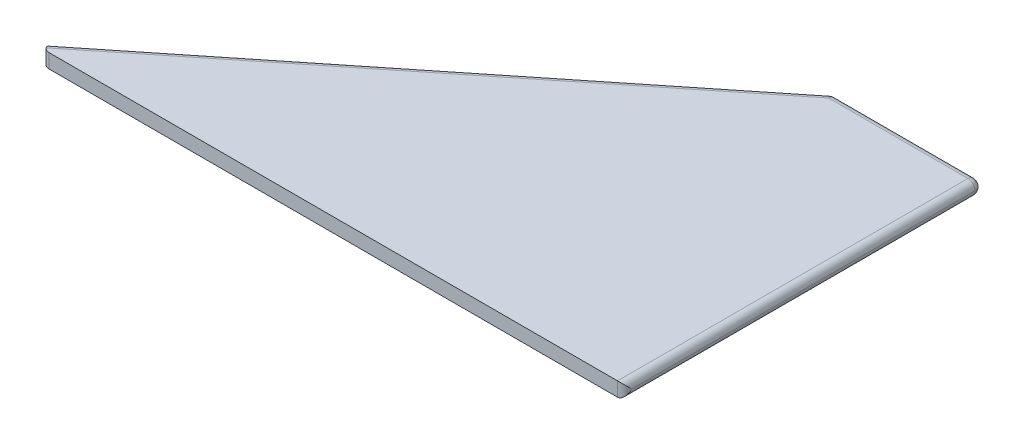
ISO-10303-21;
HEADER;
FILE_DESCRIPTION(('STEP AP214'),'2;1');
FILE_NAME('part.step','',(''),(''),'','','');
FILE_SCHEMA(('AUTOMOTIVE_DESIGN { 1 0 10303 214 1 1 1 1 }'));
ENDSEC;
DATA;
#1=APPLICATION_CONTEXT('core data for automotive mechanical design processes');
#2=APPLICATION_PROTOCOL_DEFINITION('international standard','automotive_design',2000,#1);
#3=PRODUCT_CONTEXT('',#1,'mechanical');
#4=PRODUCT('Part','Part','',(#3));
#5=PRODUCT_RELATED_PRODUCT_CATEGORY('part','',(#4));
#6=PRODUCT_DEFINITION_FORMATION('','',#4);
#7=PRODUCT_DEFINITION_CONTEXT('part definition',#1,'design');
#8=PRODUCT_DEFINITION('design','',#6,#7);
#9=PRODUCT_DEFINITION_SHAPE('','',#8);
#10=(LENGTH_UNIT() NAMED_UNIT(*) SI_UNIT(.MILLI.,.METRE.));
#11=(NAMED_UNIT(*) PLANE_ANGLE_UNIT() SI_UNIT($,.RADIAN.));
#12=(NAMED_UNIT(*) SI_UNIT($,.STERADIAN.) SOLID_ANGLE_UNIT());
#13=UNCERTAINTY_MEASURE_WITH_UNIT(LENGTH_MEASURE(1.E-05),#10,'distance_accuracy_value','');
#14=(GEOMETRIC_REPRESENTATION_CONTEXT(3) GLOBAL_UNCERTAINTY_ASSIGNED_CONTEXT((#13)) GLOBAL_UNIT_ASSIGNED_CONTEXT((#10,
#11,#12)) REPRESENTATION_CONTEXT('',''));
#15=CARTESIAN_POINT('',(0.,0.,0.));
#16=DIRECTION('',(0.,0.,1.));
#17=DIRECTION('',(1.,0.,0.));
#18=AXIS2_PLACEMENT_3D('',#15,#16,#17);
#19=CARTESIAN_POINT('',(0.,4.76,0.));
#20=DIRECTION('',(0.,0.,-1.));
#21=DIRECTION('',(-1.,0.,0.));
#22=AXIS2_PLACEMENT_3D('',#19,#20,#21);
#23=PLANE('',#22);
#24=DIRECTION('',(1.,0.,0.));
#25=VECTOR('',#24,1.);
#26=CARTESIAN_POINT('',(0.,4.76,0.));
#27=LINE('',#26,#25);
#28=CARTESIAN_POINT('',(-193.215141078727,4.76,0.));
#29=VERTEX_POINT('',#28);
#30=CARTESIAN_POINT('',(-2.38,4.76,0.));
#31=VERTEX_POINT('',#30);
#32=EDGE_CURVE('E239',#29,#31,#27,.T.);
#33=ORIENTED_EDGE('',*,*,#32,.F.);
#34=DIRECTION('',(0.,-1.,0.));
#35=VECTOR('',#34,1.);
#36=CARTESIAN_POINT('',(-193.215141078727,4.76,0.));
#37=LINE('',#36,#35);
#38=CARTESIAN_POINT('',(-193.215141078727,0.,0.));
#39=VERTEX_POINT('',#38);
#40=EDGE_CURVE('E132',#29,#39,#37,.T.);
#41=ORIENTED_EDGE('',*,*,#40,.T.);
#42=DIRECTION('',(1.,0.,0.));
#43=VECTOR('',#42,1.);
#44=CARTESIAN_POINT('',(0.,0.,0.));
#45=LINE('',#44,#43);
#46=CARTESIAN_POINT('',(-2.38,0.,0.));
#47=VERTEX_POINT('',#46);
#48=EDGE_CURVE('E242',#39,#47,#45,.T.);
#49=ORIENTED_EDGE('',*,*,#48,.T.);
#50=DIRECTION('',(0.,-1.,0.));
#51=VECTOR('',#50,1.);
#52=CARTESIAN_POINT('',(-2.38,4.76,0.));
#53=LINE('',#52,#51);
#54=EDGE_CURVE('E174',#47,#31,#53,.F.);
#55=ORIENTED_EDGE('',*,*,#54,.T.);
#56=EDGE_LOOP('',(#33,#41,#49,#55));
#57=FACE_BOUND('',#56,.T.);
#58=ADVANCED_FACE('F45',(#57),#23,.F.);
#59=CARTESIAN_POINT('',(0.,4.76,0.));
#60=DIRECTION('',(0.,-1.,0.));
#61=DIRECTION('',(0.,0.,-1.));
#62=AXIS2_PLACEMENT_3D('',#59,#60,#61);
#63=PLANE('',#62);
#64=DIRECTION('',(-0.78086880944303,0.,0.624695047554424));
#65=VECTOR('',#64,1.);
#66=CARTESIAN_POINT('',(-76.5620062746253,4.76,-95.7025078432817));
#67=LINE('',#66,#65);
#68=CARTESIAN_POINT('',(-49.1651410787274,4.76,-117.62));
#69=VERTEX_POINT('',#68);
#70=CARTESIAN_POINT('',(-195.073608845202,4.76,-0.89322578682044));
#71=VERTEX_POINT('',#70);
#72=EDGE_CURVE('E181',#69,#71,#67,.T.);
#73=ORIENTED_EDGE('',*,*,#72,.T.);
#74=CARTESIAN_POINT('',(-193.215141078727,4.76,-2.37999999999998));
#75=DIRECTION('',(0.,-1.,0.));
#76=DIRECTION('',(0.,0.,-1.));
#77=AXIS2_PLACEMENT_3D('',#74,#75,#76);
#78=CIRCLE('',#77,2.38);
#79=EDGE_CURVE('E101',#71,#29,#78,.F.);
#80=ORIENTED_EDGE('',*,*,#79,.T.);
#81=ORIENTED_EDGE('',*,*,#32,.T.);
#82=DIRECTION('',(0.,0.,-1.));
#83=VECTOR('',#82,1.);
#84=CARTESIAN_POINT('',(-2.38,4.76,0.));
#85=LINE('',#84,#83);
#86=CARTESIAN_POINT('',(-2.38,4.76,-117.62));
#87=VERTEX_POINT('',#86);
#88=EDGE_CURVE('E172',#31,#87,#85,.T.);
#89=ORIENTED_EDGE('',*,*,#88,.T.);
#90=DIRECTION('',(-1.,0.,0.));
#91=VECTOR('',#90,1.);
#92=CARTESIAN_POINT('',(0.,4.76,-117.62));
#93=LINE('',#92,#91);
#94=EDGE_CURVE('E234',#87,#69,#93,.T.);
#95=ORIENTED_EDGE('',*,*,#94,.T.);
#96=EDGE_LOOP('',(#73,#80,#81,#89,#95));
#97=FACE_BOUND('',#96,.T.);
#98=ADVANCED_FACE('F246',(#97),#63,.F.);
#99=CARTESIAN_POINT('',(0.,0.,0.));
#100=DIRECTION('',(0.,-1.,0.));
#101=DIRECTION('',(0.,0.,-1.));
#102=AXIS2_PLACEMENT_3D('',#99,#100,#101);
#103=PLANE('',#102);
#104=ORIENTED_EDGE('',*,*,#48,.F.);
#105=CARTESIAN_POINT('',(-193.215141078727,0.,-2.37999999999998));
#106=DIRECTION('',(0.,-1.,0.));
#107=DIRECTION('',(0.,0.,-1.));
#108=AXIS2_PLACEMENT_3D('',#105,#106,#107);
#109=CIRCLE('',#108,2.38);
#110=CARTESIAN_POINT('',(-195.073608845202,0.,-0.89322578682044));
#111=VERTEX_POINT('',#110);
#112=EDGE_CURVE('E11',#39,#111,#109,.T.);
#113=ORIENTED_EDGE('',*,*,#112,.T.);
#114=DIRECTION('',(-0.78086880944303,0.,0.624695047554424));
#115=VECTOR('',#114,1.);
#116=CARTESIAN_POINT('',(-48.5132257868205,0.,-118.141532233526));
#117=LINE('',#116,#115);
#118=CARTESIAN_POINT('',(-49.1651410787274,0.,-117.62));
#119=VERTEX_POINT('',#118);
#120=EDGE_CURVE('E56',#111,#119,#117,.F.);
#121=ORIENTED_EDGE('',*,*,#120,.T.);
#122=DIRECTION('',(-1.,0.,0.));
#123=VECTOR('',#122,1.);
#124=CARTESIAN_POINT('',(0.,0.,-117.62));
#125=LINE('',#124,#123);
#126=CARTESIAN_POINT('',(-2.38,0.,-117.62));
#127=VERTEX_POINT('',#126);
#128=EDGE_CURVE('E122',#119,#127,#125,.F.);
#129=ORIENTED_EDGE('',*,*,#128,.T.);
#130=DIRECTION('',(0.,0.,-1.));
#131=VECTOR('',#130,1.);
#132=CARTESIAN_POINT('',(-2.38,0.,0.));
#133=LINE('',#132,#131);
#134=EDGE_CURVE('E124',#127,#47,#133,.F.);
#135=ORIENTED_EDGE('',*,*,#134,.T.);
#136=EDGE_LOOP('',(#104,#113,#121,#129,#135));
#137=FACE_BOUND('',#136,.T.);
#138=ADVANCED_FACE('F123',(#137),#103,.T.);
#139=CARTESIAN_POINT('',(-2.38,2.38,0.));
#140=DIRECTION('',(0.,0.,1.));
#141=DIRECTION('',(1.,0.,0.));
#142=AXIS2_PLACEMENT_3D('',#139,#140,#141);
#143=CYLINDRICAL_SURFACE('',#142,2.38);
#144=CARTESIAN_POINT('',(-2.38,2.38,-2.38));
#145=DIRECTION('',(0.,0.707106781186547,0.707106781186547));
#146=DIRECTION('',(0.,-0.707106781186547,0.707106781186547));
#147=AXIS2_PLACEMENT_3D('',#144,#145,#146);
#148=ELLIPSE('',#147,3.36582827844797,2.38);
#149=CARTESIAN_POINT('',(0.,2.38,-2.38));
#150=VERTEX_POINT('',#149);
#151=EDGE_CURVE('E49',#47,#150,#148,.T.);
#152=ORIENTED_EDGE('',*,*,#151,.F.);
#153=ORIENTED_EDGE('',*,*,#134,.F.);
#154=CARTESIAN_POINT('',(-2.38,2.38,-117.62));
#155=DIRECTION('',(0.,0.,-1.));
#156=DIRECTION('',(-1.,0.,0.));
#157=AXIS2_PLACEMENT_3D('',#154,#155,#156);
#158=CIRCLE('',#157,2.38);
#159=CARTESIAN_POINT('',(0.,2.38,-117.62));
#160=VERTEX_POINT('',#159);
#161=EDGE_CURVE('E86',#160,#127,#158,.T.);
#162=ORIENTED_EDGE('',*,*,#161,.F.);
#163=DIRECTION('',(0.,0.,-1.));
#164=VECTOR('',#163,1.);
#165=CARTESIAN_POINT('',(0.,2.38,-120.));
#166=LINE('',#165,#164);
#167=EDGE_CURVE('E153',#150,#160,#166,.T.);
#168=ORIENTED_EDGE('',*,*,#167,.F.);
#169=EDGE_LOOP('',(#152,#153,#162,#168));
#170=FACE_BOUND('',#169,.T.);
#171=ADVANCED_FACE('F47',(#170),#143,.T.);
#172=CARTESIAN_POINT('',(-2.38,4.76,-2.38));
#173=DIRECTION('',(0.,-1.,0.));
#174=DIRECTION('',(0.,0.,-1.));
#175=AXIS2_PLACEMENT_3D('',#172,#173,#174);
#176=CYLINDRICAL_SURFACE('',#175,2.38);
#177=ORIENTED_EDGE('',*,*,#54,.F.);
#178=ORIENTED_EDGE('',*,*,#151,.T.);
#179=CARTESIAN_POINT('',(-2.38,2.38,-2.38));
#180=DIRECTION('',(0.,0.707106781186547,-0.707106781186547));
#181=DIRECTION('',(0.,-0.707106781186547,-0.707106781186547));
#182=AXIS2_PLACEMENT_3D('',#179,#180,#181);
#183=ELLIPSE('',#182,3.36582827844797,2.38);
#184=EDGE_CURVE('E147',#31,#150,#183,.T.);
#185=ORIENTED_EDGE('',*,*,#184,.F.);
#186=EDGE_LOOP('',(#177,#178,#185));
#187=FACE_BOUND('',#186,.T.);
#188=ADVANCED_FACE('F173',(#187),#176,.T.);
#189=CARTESIAN_POINT('',(-2.38,2.38,-117.62));
#190=DIRECTION('',(1.,0.,0.));
#191=DIRECTION('',(0.,0.,-1.));
#192=AXIS2_PLACEMENT_3D('',#189,#190,#191);
#193=SPHERICAL_SURFACE('',#192,2.38);
#194=CARTESIAN_POINT('',(-2.38,2.38,-117.62));
#195=DIRECTION('',(0.,-1.,0.));
#196=DIRECTION('',(0.,0.,-1.));
#197=AXIS2_PLACEMENT_3D('',#194,#195,#196);
#198=CIRCLE('',#197,2.38);
#199=CARTESIAN_POINT('',(-2.38,2.38,-120.));
#200=VERTEX_POINT('',#199);
#201=EDGE_CURVE('E138',#160,#200,#198,.F.);
#202=ORIENTED_EDGE('',*,*,#201,.F.);
#203=ORIENTED_EDGE('',*,*,#161,.T.);
#204=CARTESIAN_POINT('',(-2.38,2.38,-117.62));
#205=DIRECTION('',(1.,0.,0.));
#206=DIRECTION('',(0.,0.,-1.));
#207=AXIS2_PLACEMENT_3D('',#204,#205,#206);
#208=CIRCLE('',#207,2.38);
#209=EDGE_CURVE('E136',#200,#127,#208,.F.);
#210=ORIENTED_EDGE('',*,*,#209,.F.);
#211=EDGE_LOOP('',(#202,#203,#210));
#212=FACE_BOUND('',#211,.T.);
#213=ADVANCED_FACE('F135',(#212),#193,.T.);
#214=CARTESIAN_POINT('',(-2.38,2.38,0.));
#215=DIRECTION('',(0.,0.,-1.));
#216=DIRECTION('',(-1.,0.,0.));
#217=AXIS2_PLACEMENT_3D('',#214,#215,#216);
#218=CYLINDRICAL_SURFACE('',#217,2.38);
#219=ORIENTED_EDGE('',*,*,#184,.T.);
#220=ORIENTED_EDGE('',*,*,#167,.T.);
#221=CARTESIAN_POINT('',(-2.38,2.38,-117.62));
#222=DIRECTION('',(0.,0.,-1.));
#223=DIRECTION('',(-1.,0.,0.));
#224=AXIS2_PLACEMENT_3D('',#221,#222,#223);
#225=CIRCLE('',#224,2.38);
#226=EDGE_CURVE('E148',#87,#160,#225,.T.);
#227=ORIENTED_EDGE('',*,*,#226,.F.);
#228=ORIENTED_EDGE('',*,*,#88,.F.);
#229=EDGE_LOOP('',(#219,#220,#227,#228));
#230=FACE_BOUND('',#229,.T.);
#231=ADVANCED_FACE('F171',(#230),#218,.T.);
#232=CARTESIAN_POINT('',(0.,2.38,-117.62));
#233=DIRECTION('',(1.,0.,0.));
#234=DIRECTION('',(0.,0.,-1.));
#235=AXIS2_PLACEMENT_3D('',#232,#233,#234);
#236=CYLINDRICAL_SURFACE('',#235,2.38);
#237=ORIENTED_EDGE('',*,*,#209,.T.);
#238=ORIENTED_EDGE('',*,*,#128,.F.);
#239=CARTESIAN_POINT('',(-49.1651410787274,2.38,-117.62));
#240=DIRECTION('',(-1.,0.,0.));
#241=DIRECTION('',(0.,0.,1.));
#242=AXIS2_PLACEMENT_3D('',#239,#240,#241);
#243=CIRCLE('',#242,2.38);
#244=CARTESIAN_POINT('',(-49.1651410787274,2.38,-120.));
#245=VERTEX_POINT('',#244);
#246=EDGE_CURVE('E156',#245,#119,#243,.T.);
#247=ORIENTED_EDGE('',*,*,#246,.F.);
#248=DIRECTION('',(-1.,0.,0.));
#249=VECTOR('',#248,1.);
#250=CARTESIAN_POINT('',(-50.,2.38,-120.));
#251=LINE('',#250,#249);
#252=EDGE_CURVE('E144',#200,#245,#251,.T.);
#253=ORIENTED_EDGE('',*,*,#252,.F.);
#254=EDGE_LOOP('',(#237,#238,#247,#253));
#255=FACE_BOUND('',#254,.T.);
#256=ADVANCED_FACE('F142',(#255),#236,.T.);
#257=CARTESIAN_POINT('',(-2.38,2.38,-117.62));
#258=DIRECTION('',(1.,0.,0.));
#259=DIRECTION('',(0.,0.,-1.));
#260=AXIS2_PLACEMENT_3D('',#257,#258,#259);
#261=SPHERICAL_SURFACE('',#260,2.38);
#262=ORIENTED_EDGE('',*,*,#226,.T.);
#263=ORIENTED_EDGE('',*,*,#201,.T.);
#264=CARTESIAN_POINT('',(-2.38,2.38,-117.62));
#265=DIRECTION('',(1.,0.,0.));
#266=DIRECTION('',(0.,0.,-1.));
#267=AXIS2_PLACEMENT_3D('',#264,#265,#266);
#268=CIRCLE('',#267,2.38);
#269=EDGE_CURVE('E166',#87,#200,#268,.F.);
#270=ORIENTED_EDGE('',*,*,#269,.F.);
#271=EDGE_LOOP('',(#262,#263,#270));
#272=FACE_BOUND('',#271,.T.);
#273=ADVANCED_FACE('F165',(#272),#261,.T.);
#274=CARTESIAN_POINT('',(-49.1651410787274,2.38,-117.62));
#275=DIRECTION('',(0.,-1.,0.));
#276=DIRECTION('',(0.,0.,-1.));
#277=AXIS2_PLACEMENT_3D('',#274,#275,#276);
#278=SPHERICAL_SURFACE('',#277,2.38);
#279=CARTESIAN_POINT('',(-49.1651410787274,2.38,-117.62));
#280=DIRECTION('',(0.,-1.,0.));
#281=DIRECTION('',(0.,0.,-1.));
#282=AXIS2_PLACEMENT_3D('',#279,#280,#281);
#283=CIRCLE('',#282,2.38);
#284=CARTESIAN_POINT('',(-50.651915291907,2.38,-119.478467766474));
#285=VERTEX_POINT('',#284);
#286=EDGE_CURVE('E214',#245,#285,#283,.F.);
#287=ORIENTED_EDGE('',*,*,#286,.F.);
#288=ORIENTED_EDGE('',*,*,#246,.T.);
#289=CARTESIAN_POINT('',(-49.1651410787274,2.38,-117.62));
#290=DIRECTION('',(0.78086880944303,0.,-0.624695047554425));
#291=DIRECTION('',(-0.624695047554425,0.,-0.78086880944303));
#292=AXIS2_PLACEMENT_3D('',#289,#290,#291);
#293=CIRCLE('',#292,2.38);
#294=EDGE_CURVE('E206',#285,#119,#293,.F.);
#295=ORIENTED_EDGE('',*,*,#294,.F.);
#296=EDGE_LOOP('',(#287,#288,#295));
#297=FACE_BOUND('',#296,.T.);
#298=ADVANCED_FACE('F220',(#297),#278,.T.);
#299=CARTESIAN_POINT('',(0.,2.38,-117.62));
#300=DIRECTION('',(-1.,0.,0.));
#301=DIRECTION('',(0.,0.,1.));
#302=AXIS2_PLACEMENT_3D('',#299,#300,#301);
#303=CYLINDRICAL_SURFACE('',#302,2.38);
#304=ORIENTED_EDGE('',*,*,#269,.T.);
#305=ORIENTED_EDGE('',*,*,#252,.T.);
#306=CARTESIAN_POINT('',(-49.1651410787274,2.38,-117.62));
#307=DIRECTION('',(-1.,0.,0.));
#308=DIRECTION('',(0.,0.,1.));
#309=AXIS2_PLACEMENT_3D('',#306,#307,#308);
#310=CIRCLE('',#309,2.38);
#311=EDGE_CURVE('E202',#69,#245,#310,.T.);
#312=ORIENTED_EDGE('',*,*,#311,.F.);
#313=ORIENTED_EDGE('',*,*,#94,.F.);
#314=EDGE_LOOP('',(#304,#305,#312,#313));
#315=FACE_BOUND('',#314,.T.);
#316=ADVANCED_FACE('F233',(#315),#303,.T.);
#317=CARTESIAN_POINT('',(-48.5132257868205,2.38,-118.141532233526));
#318=DIRECTION('',(0.78086880944303,0.,-0.624695047554424));
#319=DIRECTION('',(-0.624695047554424,0.,-0.78086880944303));
#320=AXIS2_PLACEMENT_3D('',#317,#318,#319);
#321=CYLINDRICAL_SURFACE('',#320,2.38);
#322=ORIENTED_EDGE('',*,*,#294,.T.);
#323=ORIENTED_EDGE('',*,*,#120,.F.);
#324=CARTESIAN_POINT('',(-193.215141078727,2.38,-2.37999999999998));
#325=DIRECTION('',(0.552157630374233,-0.707106781186548,-0.441726104299386));
#326=DIRECTION('',(0.552157630374233,0.707106781186548,-0.441726104299386));
#327=AXIS2_PLACEMENT_3D('',#324,#325,#326);
#328=ELLIPSE('',#327,3.36582827844797,2.38);
#329=CARTESIAN_POINT('',(-194.701915291907,2.38,-4.23846776647439));
#330=VERTEX_POINT('',#329);
#331=EDGE_CURVE('E198',#330,#111,#328,.F.);
#332=ORIENTED_EDGE('',*,*,#331,.F.);
#333=DIRECTION('',(-0.78086880944303,0.,0.624695047554424));
#334=VECTOR('',#333,1.);
#335=CARTESIAN_POINT('',(-200.,2.38,0.));
#336=LINE('',#335,#334);
#337=EDGE_CURVE('E194',#285,#330,#336,.T.);
#338=ORIENTED_EDGE('',*,*,#337,.F.);
#339=EDGE_LOOP('',(#322,#323,#332,#338));
#340=FACE_BOUND('',#339,.T.);
#341=ADVANCED_FACE('F223',(#340),#321,.T.);
#342=CARTESIAN_POINT('',(-49.1651410787274,2.38,-117.62));
#343=DIRECTION('',(0.,1.,0.));
#344=DIRECTION('',(-1.,0.,0.));
#345=AXIS2_PLACEMENT_3D('',#342,#343,#344);
#346=SPHERICAL_SURFACE('',#345,2.38);
#347=ORIENTED_EDGE('',*,*,#311,.T.);
#348=ORIENTED_EDGE('',*,*,#286,.T.);
#349=CARTESIAN_POINT('',(-49.1651410787274,2.38,-117.62));
#350=DIRECTION('',(0.78086880944303,0.,-0.624695047554425));
#351=DIRECTION('',(-0.624695047554425,0.,-0.78086880944303));
#352=AXIS2_PLACEMENT_3D('',#349,#350,#351);
#353=CIRCLE('',#352,2.38);
#354=EDGE_CURVE('E190',#69,#285,#353,.F.);
#355=ORIENTED_EDGE('',*,*,#354,.F.);
#356=EDGE_LOOP('',(#347,#348,#355));
#357=FACE_BOUND('',#356,.T.);
#358=ADVANCED_FACE('F230',(#357),#346,.T.);
#359=CARTESIAN_POINT('',(-193.215141078727,4.76,-2.37999999999998));
#360=DIRECTION('',(0.,-1.,0.));
#361=DIRECTION('',(0.,0.,-1.));
#362=AXIS2_PLACEMENT_3D('',#359,#360,#361);
#363=CYLINDRICAL_SURFACE('',#362,2.38);
#364=ORIENTED_EDGE('',*,*,#40,.F.);
#365=ORIENTED_EDGE('',*,*,#79,.F.);
#366=CARTESIAN_POINT('',(-193.215141078727,2.38,-2.37999999999997));
#367=DIRECTION('',(-0.552157630374233,-0.707106781186548,0.441726104299386));
#368=DIRECTION('',(0.552157630374233,-0.707106781186548,-0.441726104299386));
#369=AXIS2_PLACEMENT_3D('',#366,#367,#368);
#370=ELLIPSE('',#369,3.36582827844797,2.38);
#371=EDGE_CURVE('E187',#330,#71,#370,.F.);
#372=ORIENTED_EDGE('',*,*,#371,.F.);
#373=ORIENTED_EDGE('',*,*,#331,.T.);
#374=ORIENTED_EDGE('',*,*,#112,.F.);
#375=EDGE_LOOP('',(#364,#365,#372,#373,#374));
#376=FACE_BOUND('',#375,.T.);
#377=ADVANCED_FACE('F249',(#376),#363,.T.);
#378=CARTESIAN_POINT('',(-76.5620062746253,2.38,-95.7025078432817));
#379=DIRECTION('',(-0.78086880944303,0.,0.624695047554424));
#380=DIRECTION('',(0.624695047554424,0.,0.78086880944303));
#381=AXIS2_PLACEMENT_3D('',#378,#379,#380);
#382=CYLINDRICAL_SURFACE('',#381,2.38);
#383=ORIENTED_EDGE('',*,*,#354,.T.);
#384=ORIENTED_EDGE('',*,*,#337,.T.);
#385=ORIENTED_EDGE('',*,*,#371,.T.);
#386=ORIENTED_EDGE('',*,*,#72,.F.);
#387=EDGE_LOOP('',(#383,#384,#385,#386));
#388=FACE_BOUND('',#387,.T.);
#389=ADVANCED_FACE('F228',(#388),#382,.T.);
#390=CLOSED_SHELL('',(#58,#98,#138,#171,#188,#213,#231,#256,#273,#298,#316,#341,#358,#377,#389));
#391=MANIFOLD_SOLID_BREP('B2',#390);
#392=ADVANCED_BREP_SHAPE_REPRESENTATION('',(#18,#391),#14);
#393=SHAPE_DEFINITION_REPRESENTATION(#9,#392);
ENDSEC;
END-ISO-10303-21;
